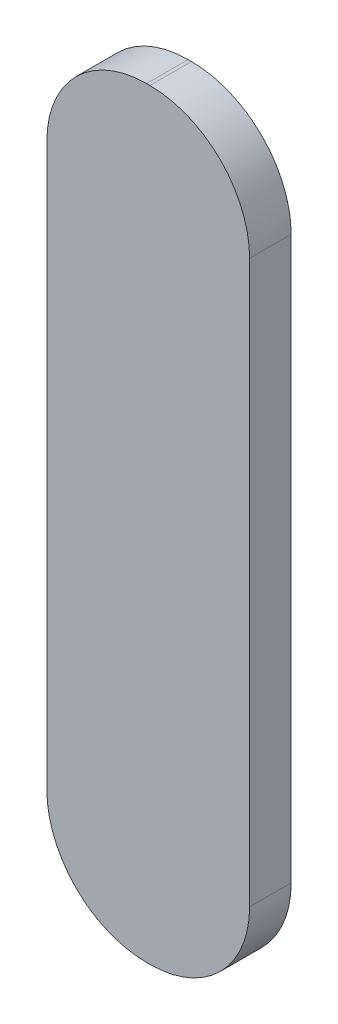
ISO-10303-21;
HEADER;
FILE_DESCRIPTION(('STEP AP214'),'2;1');
FILE_NAME('part.step','',(''),(''),'','','');
FILE_SCHEMA(('AUTOMOTIVE_DESIGN { 1 0 10303 214 1 1 1 1 }'));
ENDSEC;
DATA;
#1=APPLICATION_CONTEXT('core data for automotive mechanical design processes');
#2=APPLICATION_PROTOCOL_DEFINITION('international standard','automotive_design',2000,#1);
#3=PRODUCT_CONTEXT('',#1,'mechanical');
#4=PRODUCT('Part','Part','',(#3));
#5=PRODUCT_RELATED_PRODUCT_CATEGORY('part','',(#4));
#6=PRODUCT_DEFINITION_FORMATION('','',#4);
#7=PRODUCT_DEFINITION_CONTEXT('part definition',#1,'design');
#8=PRODUCT_DEFINITION('design','',#6,#7);
#9=PRODUCT_DEFINITION_SHAPE('','',#8);
#10=(LENGTH_UNIT() NAMED_UNIT(*) SI_UNIT(.MILLI.,.METRE.));
#11=(NAMED_UNIT(*) PLANE_ANGLE_UNIT() SI_UNIT($,.RADIAN.));
#12=(NAMED_UNIT(*) SI_UNIT($,.STERADIAN.) SOLID_ANGLE_UNIT());
#13=UNCERTAINTY_MEASURE_WITH_UNIT(LENGTH_MEASURE(1.E-05),#10,'distance_accuracy_value','');
#14=(GEOMETRIC_REPRESENTATION_CONTEXT(3) GLOBAL_UNCERTAINTY_ASSIGNED_CONTEXT((#13)) GLOBAL_UNIT_ASSIGNED_CONTEXT((#10,
#11,#12)) REPRESENTATION_CONTEXT('',''));
#15=CARTESIAN_POINT('',(0.,0.,0.));
#16=DIRECTION('',(0.,0.,1.));
#17=DIRECTION('',(1.,0.,0.));
#18=AXIS2_PLACEMENT_3D('',#15,#16,#17);
#19=CARTESIAN_POINT('',(-188.231179690793,182.888166790523,12.5));
#20=DIRECTION('',(1.,0.,0.));
#21=DIRECTION('',(0.,0.,-1.));
#22=AXIS2_PLACEMENT_3D('',#19,#20,#21);
#23=PLANE('',#22);
#24=DIRECTION('',(0.,-1.,0.));
#25=VECTOR('',#24,1.);
#26=CARTESIAN_POINT('',(-188.231179690793,182.888166790523,10.));
#27=LINE('',#26,#25);
#28=CARTESIAN_POINT('',(-188.231179690793,176.888166790523,10.));
#29=VERTEX_POINT('',#28);
#30=CARTESIAN_POINT('',(-188.231179690793,143.088166790523,10.));
#31=VERTEX_POINT('',#30);
#32=EDGE_CURVE('E142',#29,#31,#27,.T.);
#33=ORIENTED_EDGE('',*,*,#32,.T.);
#34=DIRECTION('',(0.,0.,-1.));
#35=VECTOR('',#34,1.);
#36=CARTESIAN_POINT('',(-188.231179690793,143.088166790523,12.5));
#37=LINE('',#36,#35);
#38=CARTESIAN_POINT('',(-188.231179690793,143.088166790523,12.5));
#39=VERTEX_POINT('',#38);
#40=EDGE_CURVE('E175',#31,#39,#37,.F.);
#41=ORIENTED_EDGE('',*,*,#40,.T.);
#42=DIRECTION('',(0.,-1.,0.));
#43=VECTOR('',#42,1.);
#44=CARTESIAN_POINT('',(-188.231179690793,182.888166790523,12.5));
#45=LINE('',#44,#43);
#46=CARTESIAN_POINT('',(-188.231179690793,176.888166790523,12.5));
#47=VERTEX_POINT('',#46);
#48=EDGE_CURVE('E140',#47,#39,#45,.T.);
#49=ORIENTED_EDGE('',*,*,#48,.F.);
#50=DIRECTION('',(0.,0.,-1.));
#51=VECTOR('',#50,1.);
#52=CARTESIAN_POINT('',(-188.231179690793,176.888166790523,12.5));
#53=LINE('',#52,#51);
#54=EDGE_CURVE('E171',#47,#29,#53,.T.);
#55=ORIENTED_EDGE('',*,*,#54,.T.);
#56=EDGE_LOOP('',(#33,#41,#49,#55));
#57=FACE_BOUND('',#56,.T.);
#58=ADVANCED_FACE('F39',(#57),#23,.F.);
#59=CARTESIAN_POINT('',(-188.231179690793,137.088166790523,12.5));
#60=DIRECTION('',(0.,1.,0.));
#61=DIRECTION('',(0.,0.,1.));
#62=AXIS2_PLACEMENT_3D('',#59,#60,#61);
#63=PLANE('',#62);
#64=DIRECTION('',(1.,0.,0.));
#65=VECTOR('',#64,1.);
#66=CARTESIAN_POINT('',(-188.231179690793,137.088166790523,10.));
#67=LINE('',#66,#65);
#68=CARTESIAN_POINT('',(-182.231179690793,137.088166790523,10.));
#69=VERTEX_POINT('',#68);
#70=CARTESIAN_POINT('',(-182.031179690793,137.088166790523,10.));
#71=VERTEX_POINT('',#70);
#72=EDGE_CURVE('E136',#69,#71,#67,.T.);
#73=ORIENTED_EDGE('',*,*,#72,.T.);
#74=DIRECTION('',(0.,0.,-1.));
#75=VECTOR('',#74,1.);
#76=CARTESIAN_POINT('',(-182.031179690793,137.088166790523,12.5));
#77=LINE('',#76,#75);
#78=CARTESIAN_POINT('',(-182.031179690793,137.088166790523,12.5));
#79=VERTEX_POINT('',#78);
#80=EDGE_CURVE('E111',#71,#79,#77,.F.);
#81=ORIENTED_EDGE('',*,*,#80,.T.);
#82=DIRECTION('',(1.,0.,0.));
#83=VECTOR('',#82,1.);
#84=CARTESIAN_POINT('',(-188.231179690793,137.088166790523,12.5));
#85=LINE('',#84,#83);
#86=CARTESIAN_POINT('',(-182.231179690793,137.088166790523,12.5));
#87=VERTEX_POINT('',#86);
#88=EDGE_CURVE('E182',#87,#79,#85,.T.);
#89=ORIENTED_EDGE('',*,*,#88,.F.);
#90=DIRECTION('',(0.,0.,-1.));
#91=VECTOR('',#90,1.);
#92=CARTESIAN_POINT('',(-182.231179690793,137.088166790523,12.5));
#93=LINE('',#92,#91);
#94=EDGE_CURVE('E117',#87,#69,#93,.T.);
#95=ORIENTED_EDGE('',*,*,#94,.T.);
#96=EDGE_LOOP('',(#73,#81,#89,#95));
#97=FACE_BOUND('',#96,.T.);
#98=ADVANCED_FACE('F203',(#97),#63,.F.);
#99=CARTESIAN_POINT('',(-176.031179690793,182.888166790523,12.5));
#100=DIRECTION('',(-1.,0.,0.));
#101=DIRECTION('',(0.,0.,1.));
#102=AXIS2_PLACEMENT_3D('',#99,#100,#101);
#103=PLANE('',#102);
#104=DIRECTION('',(0.,1.,0.));
#105=VECTOR('',#104,1.);
#106=CARTESIAN_POINT('',(-176.031179690793,182.888166790523,12.5));
#107=LINE('',#106,#105);
#108=CARTESIAN_POINT('',(-176.031179690793,143.088166790523,12.5));
#109=VERTEX_POINT('',#108);
#110=CARTESIAN_POINT('',(-176.031179690793,176.888166790523,12.5));
#111=VERTEX_POINT('',#110);
#112=EDGE_CURVE('E126',#109,#111,#107,.T.);
#113=ORIENTED_EDGE('',*,*,#112,.F.);
#114=DIRECTION('',(0.,0.,-1.));
#115=VECTOR('',#114,1.);
#116=CARTESIAN_POINT('',(-176.031179690793,143.088166790523,12.5));
#117=LINE('',#116,#115);
#118=CARTESIAN_POINT('',(-176.031179690793,143.088166790523,10.));
#119=VERTEX_POINT('',#118);
#120=EDGE_CURVE('E110',#109,#119,#117,.T.);
#121=ORIENTED_EDGE('',*,*,#120,.T.);
#122=DIRECTION('',(0.,1.,0.));
#123=VECTOR('',#122,1.);
#124=CARTESIAN_POINT('',(-176.031179690793,182.888166790523,10.));
#125=LINE('',#124,#123);
#126=CARTESIAN_POINT('',(-176.031179690793,176.888166790523,10.));
#127=VERTEX_POINT('',#126);
#128=EDGE_CURVE('E124',#119,#127,#125,.T.);
#129=ORIENTED_EDGE('',*,*,#128,.T.);
#130=DIRECTION('',(0.,0.,-1.));
#131=VECTOR('',#130,1.);
#132=CARTESIAN_POINT('',(-176.031179690793,176.888166790523,12.5));
#133=LINE('',#132,#131);
#134=EDGE_CURVE('E129',#127,#111,#133,.F.);
#135=ORIENTED_EDGE('',*,*,#134,.T.);
#136=EDGE_LOOP('',(#113,#121,#129,#135));
#137=FACE_BOUND('',#136,.T.);
#138=ADVANCED_FACE('F123',(#137),#103,.F.);
#139=CARTESIAN_POINT('',(-188.231179690793,182.888166790523,12.5));
#140=DIRECTION('',(0.,-1.,0.));
#141=DIRECTION('',(0.,0.,-1.));
#142=AXIS2_PLACEMENT_3D('',#139,#140,#141);
#143=PLANE('',#142);
#144=DIRECTION('',(-1.,0.,0.));
#145=VECTOR('',#144,1.);
#146=CARTESIAN_POINT('',(-188.231179690793,182.888166790523,12.5));
#147=LINE('',#146,#145);
#148=CARTESIAN_POINT('',(-182.031179690793,182.888166790523,12.5));
#149=VERTEX_POINT('',#148);
#150=CARTESIAN_POINT('',(-182.231179690793,182.888166790523,12.5));
#151=VERTEX_POINT('',#150);
#152=EDGE_CURVE('E147',#149,#151,#147,.T.);
#153=ORIENTED_EDGE('',*,*,#152,.F.);
#154=DIRECTION('',(0.,0.,-1.));
#155=VECTOR('',#154,1.);
#156=CARTESIAN_POINT('',(-182.031179690793,182.888166790523,12.5));
#157=LINE('',#156,#155);
#158=CARTESIAN_POINT('',(-182.031179690793,182.888166790523,10.));
#159=VERTEX_POINT('',#158);
#160=EDGE_CURVE('E11',#149,#159,#157,.T.);
#161=ORIENTED_EDGE('',*,*,#160,.T.);
#162=DIRECTION('',(-1.,0.,0.));
#163=VECTOR('',#162,1.);
#164=CARTESIAN_POINT('',(-188.231179690793,182.888166790523,10.));
#165=LINE('',#164,#163);
#166=CARTESIAN_POINT('',(-182.231179690793,182.888166790523,10.));
#167=VERTEX_POINT('',#166);
#168=EDGE_CURVE('E135',#159,#167,#165,.T.);
#169=ORIENTED_EDGE('',*,*,#168,.T.);
#170=DIRECTION('',(0.,0.,-1.));
#171=VECTOR('',#170,1.);
#172=CARTESIAN_POINT('',(-182.231179690793,182.888166790523,12.5));
#173=LINE('',#172,#171);
#174=EDGE_CURVE('E48',#167,#151,#173,.F.);
#175=ORIENTED_EDGE('',*,*,#174,.T.);
#176=EDGE_LOOP('',(#153,#161,#169,#175));
#177=FACE_BOUND('',#176,.T.);
#178=ADVANCED_FACE('F210',(#177),#143,.F.);
#179=CARTESIAN_POINT('',(0.,0.,12.5));
#180=DIRECTION('',(0.,0.,1.));
#181=DIRECTION('',(1.,0.,0.));
#182=AXIS2_PLACEMENT_3D('',#179,#180,#181);
#183=PLANE('',#182);
#184=ORIENTED_EDGE('',*,*,#88,.T.);
#185=CARTESIAN_POINT('',(-182.031179690793,143.088166790523,12.5));
#186=DIRECTION('',(0.,0.,1.));
#187=DIRECTION('',(1.,0.,0.));
#188=AXIS2_PLACEMENT_3D('',#185,#186,#187);
#189=CIRCLE('',#188,6.);
#190=EDGE_CURVE('E168',#79,#109,#189,.T.);
#191=ORIENTED_EDGE('',*,*,#190,.T.);
#192=ORIENTED_EDGE('',*,*,#112,.T.);
#193=CARTESIAN_POINT('',(-182.031179690793,176.888166790523,12.5));
#194=DIRECTION('',(0.,0.,1.));
#195=DIRECTION('',(1.,0.,0.));
#196=AXIS2_PLACEMENT_3D('',#193,#194,#195);
#197=CIRCLE('',#196,6.);
#198=EDGE_CURVE('E61',#111,#149,#197,.T.);
#199=ORIENTED_EDGE('',*,*,#198,.T.);
#200=ORIENTED_EDGE('',*,*,#152,.T.);
#201=CARTESIAN_POINT('',(-182.231179690793,176.888166790523,12.5));
#202=DIRECTION('',(0.,0.,1.));
#203=DIRECTION('',(1.,0.,0.));
#204=AXIS2_PLACEMENT_3D('',#201,#202,#203);
#205=CIRCLE('',#204,6.);
#206=EDGE_CURVE('E160',#151,#47,#205,.T.);
#207=ORIENTED_EDGE('',*,*,#206,.T.);
#208=ORIENTED_EDGE('',*,*,#48,.T.);
#209=CARTESIAN_POINT('',(-182.231179690793,143.088166790523,12.5));
#210=DIRECTION('',(0.,0.,1.));
#211=DIRECTION('',(1.,0.,0.));
#212=AXIS2_PLACEMENT_3D('',#209,#210,#211);
#213=CIRCLE('',#212,6.);
#214=EDGE_CURVE('E165',#39,#87,#213,.T.);
#215=ORIENTED_EDGE('',*,*,#214,.T.);
#216=EDGE_LOOP('',(#184,#191,#192,#199,#200,#207,#208,#215));
#217=FACE_BOUND('',#216,.T.);
#218=ADVANCED_FACE('F201',(#217),#183,.T.);
#219=CARTESIAN_POINT('',(0.,0.,10.));
#220=DIRECTION('',(0.,0.,1.));
#221=DIRECTION('',(1.,0.,0.));
#222=AXIS2_PLACEMENT_3D('',#219,#220,#221);
#223=PLANE('',#222);
#224=ORIENTED_EDGE('',*,*,#128,.F.);
#225=CARTESIAN_POINT('',(-182.031179690793,143.088166790523,10.));
#226=DIRECTION('',(0.,0.,1.));
#227=DIRECTION('',(1.,0.,0.));
#228=AXIS2_PLACEMENT_3D('',#225,#226,#227);
#229=CIRCLE('',#228,6.);
#230=EDGE_CURVE('E106',#119,#71,#229,.F.);
#231=ORIENTED_EDGE('',*,*,#230,.T.);
#232=ORIENTED_EDGE('',*,*,#72,.F.);
#233=CARTESIAN_POINT('',(-182.231179690793,143.088166790523,10.));
#234=DIRECTION('',(0.,0.,1.));
#235=DIRECTION('',(1.,0.,0.));
#236=AXIS2_PLACEMENT_3D('',#233,#234,#235);
#237=CIRCLE('',#236,6.);
#238=EDGE_CURVE('E118',#69,#31,#237,.F.);
#239=ORIENTED_EDGE('',*,*,#238,.T.);
#240=ORIENTED_EDGE('',*,*,#32,.F.);
#241=CARTESIAN_POINT('',(-182.231179690793,176.888166790523,10.));
#242=DIRECTION('',(0.,0.,1.));
#243=DIRECTION('',(1.,0.,0.));
#244=AXIS2_PLACEMENT_3D('',#241,#242,#243);
#245=CIRCLE('',#244,6.);
#246=EDGE_CURVE('E128',#29,#167,#245,.F.);
#247=ORIENTED_EDGE('',*,*,#246,.T.);
#248=ORIENTED_EDGE('',*,*,#168,.F.);
#249=CARTESIAN_POINT('',(-182.031179690793,176.888166790523,10.));
#250=DIRECTION('',(0.,0.,1.));
#251=DIRECTION('',(1.,0.,0.));
#252=AXIS2_PLACEMENT_3D('',#249,#250,#251);
#253=CIRCLE('',#252,6.);
#254=EDGE_CURVE('E133',#159,#127,#253,.F.);
#255=ORIENTED_EDGE('',*,*,#254,.T.);
#256=EDGE_LOOP('',(#224,#231,#232,#239,#240,#247,#248,#255));
#257=FACE_BOUND('',#256,.T.);
#258=ADVANCED_FACE('F131',(#257),#223,.F.);
#259=CARTESIAN_POINT('',(-182.031179690793,143.088166790523,12.5));
#260=DIRECTION('',(0.,0.,-1.));
#261=DIRECTION('',(-1.,0.,0.));
#262=AXIS2_PLACEMENT_3D('',#259,#260,#261);
#263=CYLINDRICAL_SURFACE('',#262,6.);
#264=ORIENTED_EDGE('',*,*,#190,.F.);
#265=ORIENTED_EDGE('',*,*,#80,.F.);
#266=ORIENTED_EDGE('',*,*,#230,.F.);
#267=ORIENTED_EDGE('',*,*,#120,.F.);
#268=EDGE_LOOP('',(#264,#265,#266,#267));
#269=FACE_BOUND('',#268,.T.);
#270=ADVANCED_FACE('F109',(#269),#263,.T.);
#271=CARTESIAN_POINT('',(-182.231179690793,143.088166790523,12.5));
#272=DIRECTION('',(0.,0.,-1.));
#273=DIRECTION('',(-1.,0.,0.));
#274=AXIS2_PLACEMENT_3D('',#271,#272,#273);
#275=CYLINDRICAL_SURFACE('',#274,6.);
#276=ORIENTED_EDGE('',*,*,#214,.F.);
#277=ORIENTED_EDGE('',*,*,#40,.F.);
#278=ORIENTED_EDGE('',*,*,#238,.F.);
#279=ORIENTED_EDGE('',*,*,#94,.F.);
#280=EDGE_LOOP('',(#276,#277,#278,#279));
#281=FACE_BOUND('',#280,.T.);
#282=ADVANCED_FACE('F198',(#281),#275,.T.);
#283=CARTESIAN_POINT('',(-182.031179690793,176.888166790523,12.5));
#284=DIRECTION('',(0.,0.,-1.));
#285=DIRECTION('',(-1.,0.,0.));
#286=AXIS2_PLACEMENT_3D('',#283,#284,#285);
#287=CYLINDRICAL_SURFACE('',#286,6.);
#288=ORIENTED_EDGE('',*,*,#198,.F.);
#289=ORIENTED_EDGE('',*,*,#134,.F.);
#290=ORIENTED_EDGE('',*,*,#254,.F.);
#291=ORIENTED_EDGE('',*,*,#160,.F.);
#292=EDGE_LOOP('',(#288,#289,#290,#291));
#293=FACE_BOUND('',#292,.T.);
#294=ADVANCED_FACE('F218',(#293),#287,.T.);
#295=CARTESIAN_POINT('',(-182.231179690793,176.888166790523,12.5));
#296=DIRECTION('',(0.,0.,-1.));
#297=DIRECTION('',(-1.,0.,0.));
#298=AXIS2_PLACEMENT_3D('',#295,#296,#297);
#299=CYLINDRICAL_SURFACE('',#298,6.);
#300=ORIENTED_EDGE('',*,*,#206,.F.);
#301=ORIENTED_EDGE('',*,*,#174,.F.);
#302=ORIENTED_EDGE('',*,*,#246,.F.);
#303=ORIENTED_EDGE('',*,*,#54,.F.);
#304=EDGE_LOOP('',(#300,#301,#302,#303));
#305=FACE_BOUND('',#304,.T.);
#306=ADVANCED_FACE('F41',(#305),#299,.T.);
#307=CLOSED_SHELL('',(#58,#98,#138,#178,#218,#258,#270,#282,#294,#306));
#308=MANIFOLD_SOLID_BREP('B2',#307);
#309=ADVANCED_BREP_SHAPE_REPRESENTATION('',(#18,#308),#14);
#310=SHAPE_DEFINITION_REPRESENTATION(#9,#309);
ENDSEC;
END-ISO-10303-21;
